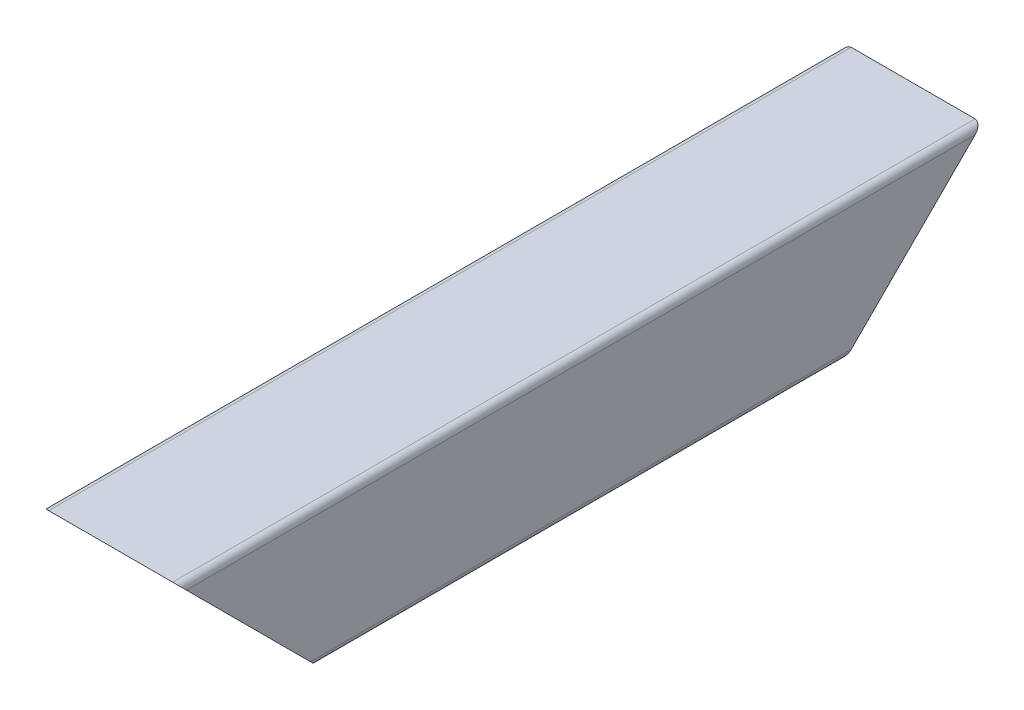
ISO-10303-21;
HEADER;
FILE_DESCRIPTION(('STEP AP214'),'2;1');
FILE_NAME('part.step','',(''),(''),'','','');
FILE_SCHEMA(('AUTOMOTIVE_DESIGN { 1 0 10303 214 1 1 1 1 }'));
ENDSEC;
DATA;
#1=APPLICATION_CONTEXT('core data for automotive mechanical design processes');
#2=APPLICATION_PROTOCOL_DEFINITION('international standard','automotive_design',2000,#1);
#3=PRODUCT_CONTEXT('',#1,'mechanical');
#4=PRODUCT('Part','Part','',(#3));
#5=PRODUCT_RELATED_PRODUCT_CATEGORY('part','',(#4));
#6=PRODUCT_DEFINITION_FORMATION('','',#4);
#7=PRODUCT_DEFINITION_CONTEXT('part definition',#1,'design');
#8=PRODUCT_DEFINITION('design','',#6,#7);
#9=PRODUCT_DEFINITION_SHAPE('','',#8);
#10=(LENGTH_UNIT() NAMED_UNIT(*) SI_UNIT(.MILLI.,.METRE.));
#11=(NAMED_UNIT(*) PLANE_ANGLE_UNIT() SI_UNIT($,.RADIAN.));
#12=(NAMED_UNIT(*) SI_UNIT($,.STERADIAN.) SOLID_ANGLE_UNIT());
#13=UNCERTAINTY_MEASURE_WITH_UNIT(LENGTH_MEASURE(1.E-05),#10,'distance_accuracy_value','');
#14=(GEOMETRIC_REPRESENTATION_CONTEXT(3) GLOBAL_UNCERTAINTY_ASSIGNED_CONTEXT((#13)) GLOBAL_UNIT_ASSIGNED_CONTEXT((#10,
#11,#12)) REPRESENTATION_CONTEXT('',''));
#15=CARTESIAN_POINT('',(0.,0.,0.));
#16=DIRECTION('',(0.,0.,1.));
#17=DIRECTION('',(1.,0.,0.));
#18=AXIS2_PLACEMENT_3D('',#15,#16,#17);
#19=CARTESIAN_POINT('',(3.,0.,350.));
#20=DIRECTION('',(-1.,0.,0.));
#21=DIRECTION('',(0.,0.,1.));
#22=AXIS2_PLACEMENT_3D('',#19,#20,#21);
#23=PLANE('',#22);
#24=DIRECTION('',(0.,0.,-1.));
#25=VECTOR('',#24,1.);
#26=CARTESIAN_POINT('',(3.,6.00000000000002,350.));
#27=LINE('',#26,#25);
#28=CARTESIAN_POINT('',(3.,6.00000000000002,296.));
#29=VERTEX_POINT('',#28);
#30=CARTESIAN_POINT('',(3.,6.00000000000002,54.0000000000002));
#31=VERTEX_POINT('',#30);
#32=EDGE_CURVE('E244',#29,#31,#27,.T.);
#33=ORIENTED_EDGE('',*,*,#32,.T.);
#34=DIRECTION('',(0.,0.707106781186546,-0.707106781186549));
#35=VECTOR('',#34,1.);
#36=CARTESIAN_POINT('',(3.,-145.,205.000000000001));
#37=LINE('',#36,#35);
#38=CARTESIAN_POINT('',(3.,54.,6.00000000000012));
#39=VERTEX_POINT('',#38);
#40=EDGE_CURVE('E59',#31,#39,#37,.T.);
#41=ORIENTED_EDGE('',*,*,#40,.T.);
#42=DIRECTION('',(0.,0.,-1.));
#43=VECTOR('',#42,1.);
#44=CARTESIAN_POINT('',(3.,54.,350.));
#45=LINE('',#44,#43);
#46=CARTESIAN_POINT('',(3.,54.,344.));
#47=VERTEX_POINT('',#46);
#48=EDGE_CURVE('E11',#47,#39,#45,.T.);
#49=ORIENTED_EDGE('',*,*,#48,.F.);
#50=DIRECTION('',(0.,0.707106781186546,0.707106781186549));
#51=VECTOR('',#50,1.);
#52=CARTESIAN_POINT('',(3.,30.,320.));
#53=LINE('',#52,#51);
#54=EDGE_CURVE('E198',#29,#47,#53,.T.);
#55=ORIENTED_EDGE('',*,*,#54,.F.);
#56=EDGE_LOOP('',(#33,#41,#49,#55));
#57=FACE_BOUND('',#56,.T.);
#58=ADVANCED_FACE('F38',(#57),#23,.F.);
#59=CARTESIAN_POINT('',(6.00000000000001,54.,350.));
#60=DIRECTION('',(0.,0.,-1.));
#61=DIRECTION('',(-1.,0.,0.));
#62=AXIS2_PLACEMENT_3D('',#59,#60,#61);
#63=CYLINDRICAL_SURFACE('',#62,3.);
#64=ORIENTED_EDGE('',*,*,#48,.T.);
#65=CARTESIAN_POINT('',(6.00000000000001,54.,6.00000000000006));
#66=DIRECTION('',(0.,0.707106781186549,0.707106781186546));
#67=DIRECTION('',(0.,0.707106781186546,-0.707106781186549));
#68=AXIS2_PLACEMENT_3D('',#65,#66,#67);
#69=ELLIPSE('',#68,4.2426406871193,3.);
#70=CARTESIAN_POINT('',(6.00000000000002,57.,3.00000000000006));
#71=VERTEX_POINT('',#70);
#72=EDGE_CURVE('E293',#39,#71,#69,.F.);
#73=ORIENTED_EDGE('',*,*,#72,.T.);
#74=DIRECTION('',(0.,0.,-1.));
#75=VECTOR('',#74,1.);
#76=CARTESIAN_POINT('',(6.00000000000002,57.,350.));
#77=LINE('',#76,#75);
#78=CARTESIAN_POINT('',(6.00000000000002,57.,347.));
#79=VERTEX_POINT('',#78);
#80=EDGE_CURVE('E48',#79,#71,#77,.T.);
#81=ORIENTED_EDGE('',*,*,#80,.F.);
#82=CARTESIAN_POINT('',(6.00000000000001,54.,344.));
#83=DIRECTION('',(0.,-0.707106781186549,0.707106781186546));
#84=DIRECTION('',(0.,-0.707106781186546,-0.707106781186549));
#85=AXIS2_PLACEMENT_3D('',#82,#83,#84);
#86=ELLIPSE('',#85,4.2426406871193,3.);
#87=EDGE_CURVE('E291',#47,#79,#86,.F.);
#88=ORIENTED_EDGE('',*,*,#87,.F.);
#89=EDGE_LOOP('',(#64,#73,#81,#88));
#90=FACE_BOUND('',#89,.T.);
#91=ADVANCED_FACE('F290',(#90),#63,.F.);
#92=CARTESIAN_POINT('',(0.,57.,350.));
#93=DIRECTION('',(0.,1.,0.));
#94=DIRECTION('',(0.,0.,1.));
#95=AXIS2_PLACEMENT_3D('',#92,#93,#94);
#96=PLANE('',#95);
#97=ORIENTED_EDGE('',*,*,#80,.T.);
#98=DIRECTION('',(1.,0.,0.));
#99=VECTOR('',#98,1.);
#100=CARTESIAN_POINT('',(0.,57.,3.00000000000006));
#101=LINE('',#100,#99);
#102=CARTESIAN_POINT('',(54.,57.,3.00000000000006));
#103=VERTEX_POINT('',#102);
#104=EDGE_CURVE('E285',#71,#103,#101,.T.);
#105=ORIENTED_EDGE('',*,*,#104,.T.);
#106=DIRECTION('',(0.,0.,-1.));
#107=VECTOR('',#106,1.);
#108=CARTESIAN_POINT('',(54.,57.,350.));
#109=LINE('',#108,#107);
#110=CARTESIAN_POINT('',(54.,57.,347.));
#111=VERTEX_POINT('',#110);
#112=EDGE_CURVE('E275',#111,#103,#109,.T.);
#113=ORIENTED_EDGE('',*,*,#112,.F.);
#114=DIRECTION('',(1.,0.,0.));
#115=VECTOR('',#114,1.);
#116=CARTESIAN_POINT('',(0.,57.,347.));
#117=LINE('',#116,#115);
#118=EDGE_CURVE('E286',#79,#111,#117,.T.);
#119=ORIENTED_EDGE('',*,*,#118,.F.);
#120=EDGE_LOOP('',(#97,#105,#113,#119));
#121=FACE_BOUND('',#120,.T.);
#122=ADVANCED_FACE('F283',(#121),#96,.F.);
#123=CARTESIAN_POINT('',(54.,54.,350.));
#124=DIRECTION('',(0.,0.,-1.));
#125=DIRECTION('',(-1.,0.,0.));
#126=AXIS2_PLACEMENT_3D('',#123,#124,#125);
#127=CYLINDRICAL_SURFACE('',#126,3.);
#128=ORIENTED_EDGE('',*,*,#112,.T.);
#129=CARTESIAN_POINT('',(54.,54.,6.00000000000006));
#130=DIRECTION('',(0.,0.707106781186549,0.707106781186546));
#131=DIRECTION('',(0.,0.707106781186546,-0.707106781186549));
#132=AXIS2_PLACEMENT_3D('',#129,#130,#131);
#133=ELLIPSE('',#132,4.2426406871193,3.);
#134=CARTESIAN_POINT('',(57.,53.9999999999999,6.00000000000009));
#135=VERTEX_POINT('',#134);
#136=EDGE_CURVE('E300',#103,#135,#133,.F.);
#137=ORIENTED_EDGE('',*,*,#136,.T.);
#138=DIRECTION('',(0.,0.,-1.));
#139=VECTOR('',#138,1.);
#140=CARTESIAN_POINT('',(57.,54.,350.));
#141=LINE('',#140,#139);
#142=CARTESIAN_POINT('',(57.,54.,344.));
#143=VERTEX_POINT('',#142);
#144=EDGE_CURVE('E271',#143,#135,#141,.T.);
#145=ORIENTED_EDGE('',*,*,#144,.F.);
#146=CARTESIAN_POINT('',(54.,54.,344.));
#147=DIRECTION('',(0.,-0.707106781186549,0.707106781186546));
#148=DIRECTION('',(0.,-0.707106781186546,-0.707106781186549));
#149=AXIS2_PLACEMENT_3D('',#146,#147,#148);
#150=ELLIPSE('',#149,4.2426406871193,3.);
#151=EDGE_CURVE('E335',#111,#143,#150,.F.);
#152=ORIENTED_EDGE('',*,*,#151,.F.);
#153=EDGE_LOOP('',(#128,#137,#145,#152));
#154=FACE_BOUND('',#153,.T.);
#155=ADVANCED_FACE('F371',(#154),#127,.F.);
#156=CARTESIAN_POINT('',(57.,0.,350.));
#157=DIRECTION('',(-1.,0.,0.));
#158=DIRECTION('',(0.,0.,1.));
#159=AXIS2_PLACEMENT_3D('',#156,#157,#158);
#160=PLANE('',#159);
#161=DIRECTION('',(0.,0.707106781186546,-0.707106781186549));
#162=VECTOR('',#161,1.);
#163=CARTESIAN_POINT('',(57.,-145.,205.000000000001));
#164=LINE('',#163,#162);
#165=CARTESIAN_POINT('',(57.,6.00000000000002,54.0000000000002));
#166=VERTEX_POINT('',#165);
#167=EDGE_CURVE('E364',#166,#135,#164,.T.);
#168=ORIENTED_EDGE('',*,*,#167,.F.);
#169=DIRECTION('',(0.,0.,-1.));
#170=VECTOR('',#169,1.);
#171=CARTESIAN_POINT('',(57.,6.00000000000002,350.));
#172=LINE('',#171,#170);
#173=CARTESIAN_POINT('',(57.,6.00000000000002,296.));
#174=VERTEX_POINT('',#173);
#175=EDGE_CURVE('E267',#174,#166,#172,.T.);
#176=ORIENTED_EDGE('',*,*,#175,.F.);
#177=DIRECTION('',(0.,0.707106781186546,0.707106781186549));
#178=VECTOR('',#177,1.);
#179=CARTESIAN_POINT('',(57.,30.,320.));
#180=LINE('',#179,#178);
#181=EDGE_CURVE('E331',#174,#143,#180,.T.);
#182=ORIENTED_EDGE('',*,*,#181,.T.);
#183=ORIENTED_EDGE('',*,*,#144,.T.);
#184=EDGE_LOOP('',(#168,#176,#182,#183));
#185=FACE_BOUND('',#184,.T.);
#186=ADVANCED_FACE('F375',(#185),#160,.T.);
#187=CARTESIAN_POINT('',(54.,6.,350.));
#188=DIRECTION('',(0.,0.,-1.));
#189=DIRECTION('',(-1.,0.,0.));
#190=AXIS2_PLACEMENT_3D('',#187,#188,#189);
#191=CYLINDRICAL_SURFACE('',#190,3.);
#192=ORIENTED_EDGE('',*,*,#175,.T.);
#193=CARTESIAN_POINT('',(54.,6.,54.0000000000002));
#194=DIRECTION('',(0.,0.707106781186549,0.707106781186546));
#195=DIRECTION('',(0.,0.707106781186546,-0.707106781186549));
#196=AXIS2_PLACEMENT_3D('',#193,#194,#195);
#197=ELLIPSE('',#196,4.24264068711929,3.);
#198=CARTESIAN_POINT('',(54.,3.,57.0000000000003));
#199=VERTEX_POINT('',#198);
#200=EDGE_CURVE('E354',#166,#199,#197,.F.);
#201=ORIENTED_EDGE('',*,*,#200,.T.);
#202=DIRECTION('',(0.,0.,-1.));
#203=VECTOR('',#202,1.);
#204=CARTESIAN_POINT('',(54.,3.,350.));
#205=LINE('',#204,#203);
#206=CARTESIAN_POINT('',(54.,3.,293.));
#207=VERTEX_POINT('',#206);
#208=EDGE_CURVE('E260',#207,#199,#205,.T.);
#209=ORIENTED_EDGE('',*,*,#208,.F.);
#210=CARTESIAN_POINT('',(54.,6.,296.));
#211=DIRECTION('',(0.,-0.707106781186549,0.707106781186546));
#212=DIRECTION('',(0.,-0.707106781186546,-0.707106781186549));
#213=AXIS2_PLACEMENT_3D('',#210,#211,#212);
#214=ELLIPSE('',#213,4.24264068711929,3.);
#215=EDGE_CURVE('E328',#174,#207,#214,.F.);
#216=ORIENTED_EDGE('',*,*,#215,.F.);
#217=EDGE_LOOP('',(#192,#201,#209,#216));
#218=FACE_BOUND('',#217,.T.);
#219=ADVANCED_FACE('F380',(#218),#191,.F.);
#220=CARTESIAN_POINT('',(0.,3.,350.));
#221=DIRECTION('',(0.,1.,0.));
#222=DIRECTION('',(0.,0.,1.));
#223=AXIS2_PLACEMENT_3D('',#220,#221,#222);
#224=PLANE('',#223);
#225=DIRECTION('',(1.,0.,0.));
#226=VECTOR('',#225,1.);
#227=CARTESIAN_POINT('',(0.,3.,57.0000000000003));
#228=LINE('',#227,#226);
#229=CARTESIAN_POINT('',(6.00000000000002,3.,57.0000000000002));
#230=VERTEX_POINT('',#229);
#231=EDGE_CURVE('E350',#230,#199,#228,.T.);
#232=ORIENTED_EDGE('',*,*,#231,.F.);
#233=DIRECTION('',(0.,0.,-1.));
#234=VECTOR('',#233,1.);
#235=CARTESIAN_POINT('',(6.00000000000002,3.,350.));
#236=LINE('',#235,#234);
#237=CARTESIAN_POINT('',(6.00000000000002,3.,293.));
#238=VERTEX_POINT('',#237);
#239=EDGE_CURVE('E252',#238,#230,#236,.T.);
#240=ORIENTED_EDGE('',*,*,#239,.F.);
#241=DIRECTION('',(1.,0.,0.));
#242=VECTOR('',#241,1.);
#243=CARTESIAN_POINT('',(0.,3.,293.));
#244=LINE('',#243,#242);
#245=EDGE_CURVE('E70',#238,#207,#244,.T.);
#246=ORIENTED_EDGE('',*,*,#245,.T.);
#247=ORIENTED_EDGE('',*,*,#208,.T.);
#248=EDGE_LOOP('',(#232,#240,#246,#247));
#249=FACE_BOUND('',#248,.T.);
#250=ADVANCED_FACE('F382',(#249),#224,.T.);
#251=CARTESIAN_POINT('',(3.,57.,350.));
#252=DIRECTION('',(0.,0.,-1.));
#253=DIRECTION('',(-1.,0.,0.));
#254=AXIS2_PLACEMENT_3D('',#251,#252,#253);
#255=CYLINDRICAL_SURFACE('',#254,3.);
#256=CARTESIAN_POINT('',(3.,57.,3.00000000000006));
#257=DIRECTION('',(0.,0.707106781186549,0.707106781186546));
#258=DIRECTION('',(0.,0.707106781186546,-0.707106781186549));
#259=AXIS2_PLACEMENT_3D('',#256,#257,#258);
#260=ELLIPSE('',#259,4.2426406871193,3.);
#261=CARTESIAN_POINT('',(0.,56.9999999999999,3.00000000000009));
#262=VERTEX_POINT('',#261);
#263=CARTESIAN_POINT('',(3.00000000000002,60.,0.));
#264=VERTEX_POINT('',#263);
#265=EDGE_CURVE('E191',#262,#264,#260,.F.);
#266=ORIENTED_EDGE('',*,*,#265,.F.);
#267=DIRECTION('',(0.,0.,-1.));
#268=VECTOR('',#267,1.);
#269=CARTESIAN_POINT('',(0.,57.,350.));
#270=LINE('',#269,#268);
#271=CARTESIAN_POINT('',(0.,57.,347.));
#272=VERTEX_POINT('',#271);
#273=EDGE_CURVE('E42',#272,#262,#270,.T.);
#274=ORIENTED_EDGE('',*,*,#273,.F.);
#275=CARTESIAN_POINT('',(3.,57.,347.));
#276=DIRECTION('',(0.,-0.707106781186549,0.707106781186546));
#277=DIRECTION('',(0.,-0.707106781186546,-0.707106781186549));
#278=AXIS2_PLACEMENT_3D('',#275,#276,#277);
#279=ELLIPSE('',#278,4.2426406871193,3.);
#280=CARTESIAN_POINT('',(3.,59.9999999999998,350.));
#281=VERTEX_POINT('',#280);
#282=EDGE_CURVE('E320',#272,#281,#279,.F.);
#283=ORIENTED_EDGE('',*,*,#282,.T.);
#284=DIRECTION('',(0.,0.,-1.));
#285=VECTOR('',#284,1.);
#286=CARTESIAN_POINT('',(3.00000000000002,60.,350.));
#287=LINE('',#286,#285);
#288=EDGE_CURVE('E214',#281,#264,#287,.T.);
#289=ORIENTED_EDGE('',*,*,#288,.T.);
#290=EDGE_LOOP('',(#266,#274,#283,#289));
#291=FACE_BOUND('',#290,.T.);
#292=ADVANCED_FACE('F40',(#291),#255,.T.);
#293=CARTESIAN_POINT('',(0.,0.,350.));
#294=DIRECTION('',(-1.,0.,0.));
#295=DIRECTION('',(0.,0.,1.));
#296=AXIS2_PLACEMENT_3D('',#293,#294,#295);
#297=PLANE('',#296);
#298=DIRECTION('',(0.,0.707106781186546,-0.707106781186549));
#299=VECTOR('',#298,1.);
#300=CARTESIAN_POINT('',(0.,-145.,205.000000000001));
#301=LINE('',#300,#299);
#302=CARTESIAN_POINT('',(0.,3.00000000000002,57.0000000000002));
#303=VERTEX_POINT('',#302);
#304=EDGE_CURVE('E357',#303,#262,#301,.T.);
#305=ORIENTED_EDGE('',*,*,#304,.F.);
#306=DIRECTION('',(0.,0.,-1.));
#307=VECTOR('',#306,1.);
#308=CARTESIAN_POINT('',(0.,3.00000000000002,350.));
#309=LINE('',#308,#307);
#310=CARTESIAN_POINT('',(0.,3.00000000000002,293.));
#311=VERTEX_POINT('',#310);
#312=EDGE_CURVE('E233',#311,#303,#309,.T.);
#313=ORIENTED_EDGE('',*,*,#312,.F.);
#314=DIRECTION('',(0.,0.707106781186546,0.707106781186549));
#315=VECTOR('',#314,1.);
#316=CARTESIAN_POINT('',(0.,30.,320.));
#317=LINE('',#316,#315);
#318=EDGE_CURVE('E317',#311,#272,#317,.T.);
#319=ORIENTED_EDGE('',*,*,#318,.T.);
#320=ORIENTED_EDGE('',*,*,#273,.T.);
#321=EDGE_LOOP('',(#305,#313,#319,#320));
#322=FACE_BOUND('',#321,.T.);
#323=ADVANCED_FACE('F416',(#322),#297,.T.);
#324=CARTESIAN_POINT('',(3.,3.,350.));
#325=DIRECTION('',(0.,0.,-1.));
#326=DIRECTION('',(-1.,0.,0.));
#327=AXIS2_PLACEMENT_3D('',#324,#325,#326);
#328=CYLINDRICAL_SURFACE('',#327,3.);
#329=CARTESIAN_POINT('',(3.,3.,57.0000000000003));
#330=DIRECTION('',(0.,0.707106781186549,0.707106781186546));
#331=DIRECTION('',(0.,0.707106781186546,-0.707106781186549));
#332=AXIS2_PLACEMENT_3D('',#329,#330,#331);
#333=ELLIPSE('',#332,4.24264068711929,3.);
#334=CARTESIAN_POINT('',(3.00000000000002,0.,60.0000000000003));
#335=VERTEX_POINT('',#334);
#336=EDGE_CURVE('E423',#335,#303,#333,.F.);
#337=ORIENTED_EDGE('',*,*,#336,.F.);
#338=DIRECTION('',(0.,0.,-1.));
#339=VECTOR('',#338,1.);
#340=CARTESIAN_POINT('',(3.00000000000002,0.,350.));
#341=LINE('',#340,#339);
#342=CARTESIAN_POINT('',(3.00000000000002,0.,290.));
#343=VERTEX_POINT('',#342);
#344=EDGE_CURVE('E230',#343,#335,#341,.T.);
#345=ORIENTED_EDGE('',*,*,#344,.F.);
#346=CARTESIAN_POINT('',(3.,3.,293.));
#347=DIRECTION('',(0.,-0.707106781186549,0.707106781186546));
#348=DIRECTION('',(0.,-0.707106781186546,-0.707106781186549));
#349=AXIS2_PLACEMENT_3D('',#346,#347,#348);
#350=ELLIPSE('',#349,4.24264068711929,3.);
#351=EDGE_CURVE('E315',#343,#311,#350,.F.);
#352=ORIENTED_EDGE('',*,*,#351,.T.);
#353=ORIENTED_EDGE('',*,*,#312,.T.);
#354=EDGE_LOOP('',(#337,#345,#352,#353));
#355=FACE_BOUND('',#354,.T.);
#356=ADVANCED_FACE('F413',(#355),#328,.T.);
#357=CARTESIAN_POINT('',(0.,0.,350.));
#358=DIRECTION('',(0.,1.,0.));
#359=DIRECTION('',(0.,0.,1.));
#360=AXIS2_PLACEMENT_3D('',#357,#358,#359);
#361=PLANE('',#360);
#362=ORIENTED_EDGE('',*,*,#344,.T.);
#363=DIRECTION('',(1.,0.,0.));
#364=VECTOR('',#363,1.);
#365=CARTESIAN_POINT('',(0.,0.,60.0000000000003));
#366=LINE('',#365,#364);
#367=CARTESIAN_POINT('',(57.,0.,60.0000000000003));
#368=VERTEX_POINT('',#367);
#369=EDGE_CURVE('E424',#335,#368,#366,.T.);
#370=ORIENTED_EDGE('',*,*,#369,.T.);
#371=DIRECTION('',(0.,0.,-1.));
#372=VECTOR('',#371,1.);
#373=CARTESIAN_POINT('',(57.,0.,350.));
#374=LINE('',#373,#372);
#375=CARTESIAN_POINT('',(57.,0.,290.));
#376=VERTEX_POINT('',#375);
#377=EDGE_CURVE('E226',#376,#368,#374,.T.);
#378=ORIENTED_EDGE('',*,*,#377,.F.);
#379=DIRECTION('',(1.,0.,0.));
#380=VECTOR('',#379,1.);
#381=CARTESIAN_POINT('',(0.,0.,290.));
#382=LINE('',#381,#380);
#383=EDGE_CURVE('E312',#343,#376,#382,.T.);
#384=ORIENTED_EDGE('',*,*,#383,.F.);
#385=EDGE_LOOP('',(#362,#370,#378,#384));
#386=FACE_BOUND('',#385,.T.);
#387=ADVANCED_FACE('F409',(#386),#361,.F.);
#388=CARTESIAN_POINT('',(57.,3.,350.));
#389=DIRECTION('',(0.,0.,-1.));
#390=DIRECTION('',(-1.,0.,0.));
#391=AXIS2_PLACEMENT_3D('',#388,#389,#390);
#392=CYLINDRICAL_SURFACE('',#391,3.);
#393=ORIENTED_EDGE('',*,*,#377,.T.);
#394=CARTESIAN_POINT('',(57.,3.,57.0000000000003));
#395=DIRECTION('',(0.,0.707106781186549,0.707106781186546));
#396=DIRECTION('',(0.,0.707106781186546,-0.707106781186549));
#397=AXIS2_PLACEMENT_3D('',#394,#395,#396);
#398=ELLIPSE('',#397,4.24264068711929,3.);
#399=CARTESIAN_POINT('',(60.,3.00000000000003,57.0000000000002));
#400=VERTEX_POINT('',#399);
#401=EDGE_CURVE('E429',#368,#400,#398,.T.);
#402=ORIENTED_EDGE('',*,*,#401,.T.);
#403=DIRECTION('',(0.,0.,-1.));
#404=VECTOR('',#403,1.);
#405=CARTESIAN_POINT('',(60.,3.00000000000002,350.));
#406=LINE('',#405,#404);
#407=CARTESIAN_POINT('',(60.,3.00000000000002,293.));
#408=VERTEX_POINT('',#407);
#409=EDGE_CURVE('E219',#408,#400,#406,.T.);
#410=ORIENTED_EDGE('',*,*,#409,.F.);
#411=CARTESIAN_POINT('',(57.,3.,293.));
#412=DIRECTION('',(0.,-0.707106781186549,0.707106781186546));
#413=DIRECTION('',(0.,-0.707106781186546,-0.707106781186549));
#414=AXIS2_PLACEMENT_3D('',#411,#412,#413);
#415=ELLIPSE('',#414,4.24264068711929,3.);
#416=EDGE_CURVE('E309',#376,#408,#415,.T.);
#417=ORIENTED_EDGE('',*,*,#416,.F.);
#418=EDGE_LOOP('',(#393,#402,#410,#417));
#419=FACE_BOUND('',#418,.T.);
#420=ADVANCED_FACE('F405',(#419),#392,.T.);
#421=CARTESIAN_POINT('',(60.,0.,350.));
#422=DIRECTION('',(-1.,0.,0.));
#423=DIRECTION('',(0.,0.,1.));
#424=AXIS2_PLACEMENT_3D('',#421,#422,#423);
#425=PLANE('',#424);
#426=ORIENTED_EDGE('',*,*,#409,.T.);
#427=DIRECTION('',(0.,0.707106781186546,-0.707106781186549));
#428=VECTOR('',#427,1.);
#429=CARTESIAN_POINT('',(60.,-145.,205.000000000001));
#430=LINE('',#429,#428);
#431=CARTESIAN_POINT('',(60.,57.,3.00000000000006));
#432=VERTEX_POINT('',#431);
#433=EDGE_CURVE('E210',#400,#432,#430,.T.);
#434=ORIENTED_EDGE('',*,*,#433,.T.);
#435=DIRECTION('',(0.,0.,-1.));
#436=VECTOR('',#435,1.);
#437=CARTESIAN_POINT('',(60.,57.,350.));
#438=LINE('',#437,#436);
#439=CARTESIAN_POINT('',(60.,57.,347.));
#440=VERTEX_POINT('',#439);
#441=EDGE_CURVE('E208',#440,#432,#438,.T.);
#442=ORIENTED_EDGE('',*,*,#441,.F.);
#443=DIRECTION('',(0.,0.707106781186546,0.707106781186549));
#444=VECTOR('',#443,1.);
#445=CARTESIAN_POINT('',(60.,30.,320.));
#446=LINE('',#445,#444);
#447=EDGE_CURVE('E306',#408,#440,#446,.T.);
#448=ORIENTED_EDGE('',*,*,#447,.F.);
#449=EDGE_LOOP('',(#426,#434,#442,#448));
#450=FACE_BOUND('',#449,.T.);
#451=ADVANCED_FACE('F402',(#450),#425,.F.);
#452=CARTESIAN_POINT('',(57.,57.,350.));
#453=DIRECTION('',(0.,0.,-1.));
#454=DIRECTION('',(-1.,0.,0.));
#455=AXIS2_PLACEMENT_3D('',#452,#453,#454);
#456=CYLINDRICAL_SURFACE('',#455,3.);
#457=CARTESIAN_POINT('',(57.,57.,3.00000000000006));
#458=DIRECTION('',(0.,0.707106781186549,0.707106781186546));
#459=DIRECTION('',(0.,0.707106781186546,-0.707106781186549));
#460=AXIS2_PLACEMENT_3D('',#457,#458,#459);
#461=ELLIPSE('',#460,4.2426406871193,3.);
#462=CARTESIAN_POINT('',(57.,60.,0.));
#463=VERTEX_POINT('',#462);
#464=EDGE_CURVE('E188',#463,#432,#461,.F.);
#465=ORIENTED_EDGE('',*,*,#464,.F.);
#466=DIRECTION('',(0.,0.,-1.));
#467=VECTOR('',#466,1.);
#468=CARTESIAN_POINT('',(57.,60.,350.));
#469=LINE('',#468,#467);
#470=CARTESIAN_POINT('',(57.,60.,350.));
#471=VERTEX_POINT('',#470);
#472=EDGE_CURVE('E205',#471,#463,#469,.T.);
#473=ORIENTED_EDGE('',*,*,#472,.F.);
#474=CARTESIAN_POINT('',(57.,57.,347.));
#475=DIRECTION('',(0.,-0.707106781186549,0.707106781186546));
#476=DIRECTION('',(0.,-0.707106781186546,-0.707106781186549));
#477=AXIS2_PLACEMENT_3D('',#474,#475,#476);
#478=ELLIPSE('',#477,4.2426406871193,3.);
#479=EDGE_CURVE('E298',#471,#440,#478,.F.);
#480=ORIENTED_EDGE('',*,*,#479,.T.);
#481=ORIENTED_EDGE('',*,*,#441,.T.);
#482=EDGE_LOOP('',(#465,#473,#480,#481));
#483=FACE_BOUND('',#482,.T.);
#484=ADVANCED_FACE('F203',(#483),#456,.T.);
#485=CARTESIAN_POINT('',(6.00000000000001,6.,350.));
#486=DIRECTION('',(0.,0.,-1.));
#487=DIRECTION('',(-1.,0.,0.));
#488=AXIS2_PLACEMENT_3D('',#485,#486,#487);
#489=CYLINDRICAL_SURFACE('',#488,3.);
#490=CARTESIAN_POINT('',(6.00000000000001,6.,54.0000000000002));
#491=DIRECTION('',(0.,0.707106781186549,0.707106781186546));
#492=DIRECTION('',(0.,0.707106781186546,-0.707106781186549));
#493=AXIS2_PLACEMENT_3D('',#490,#491,#492);
#494=ELLIPSE('',#493,4.24264068711929,3.);
#495=EDGE_CURVE('E347',#31,#230,#494,.T.);
#496=ORIENTED_EDGE('',*,*,#495,.F.);
#497=ORIENTED_EDGE('',*,*,#32,.F.);
#498=CARTESIAN_POINT('',(6.00000000000001,6.,296.));
#499=DIRECTION('',(0.,-0.707106781186549,0.707106781186546));
#500=DIRECTION('',(0.,-0.707106781186546,-0.707106781186549));
#501=AXIS2_PLACEMENT_3D('',#498,#499,#500);
#502=ELLIPSE('',#501,4.24264068711929,3.);
#503=EDGE_CURVE('E324',#29,#238,#502,.T.);
#504=ORIENTED_EDGE('',*,*,#503,.T.);
#505=ORIENTED_EDGE('',*,*,#239,.T.);
#506=EDGE_LOOP('',(#496,#497,#504,#505));
#507=FACE_BOUND('',#506,.T.);
#508=ADVANCED_FACE('F345',(#507),#489,.F.);
#509=CARTESIAN_POINT('',(0.,60.,350.));
#510=DIRECTION('',(0.,1.,0.));
#511=DIRECTION('',(0.,0.,1.));
#512=AXIS2_PLACEMENT_3D('',#509,#510,#511);
#513=PLANE('',#512);
#514=DIRECTION('',(1.,0.,0.));
#515=VECTOR('',#514,1.);
#516=CARTESIAN_POINT('',(0.,60.,0.));
#517=LINE('',#516,#515);
#518=EDGE_CURVE('E185',#264,#463,#517,.T.);
#519=ORIENTED_EDGE('',*,*,#518,.F.);
#520=ORIENTED_EDGE('',*,*,#288,.F.);
#521=DIRECTION('',(1.,0.,0.));
#522=VECTOR('',#521,1.);
#523=CARTESIAN_POINT('',(0.,60.,350.));
#524=LINE('',#523,#522);
#525=EDGE_CURVE('E197',#281,#471,#524,.T.);
#526=ORIENTED_EDGE('',*,*,#525,.T.);
#527=ORIENTED_EDGE('',*,*,#472,.T.);
#528=EDGE_LOOP('',(#519,#520,#526,#527));
#529=FACE_BOUND('',#528,.T.);
#530=ADVANCED_FACE('F212',(#529),#513,.T.);
#531=CARTESIAN_POINT('',(0.,-145.,144.999999999999));
#532=DIRECTION('',(0.,-0.707106781186549,0.707106781186546));
#533=DIRECTION('',(0.,-0.707106781186546,-0.707106781186549));
#534=AXIS2_PLACEMENT_3D('',#531,#532,#533);
#535=PLANE('',#534);
#536=ORIENTED_EDGE('',*,*,#318,.F.);
#537=ORIENTED_EDGE('',*,*,#351,.F.);
#538=ORIENTED_EDGE('',*,*,#383,.T.);
#539=ORIENTED_EDGE('',*,*,#416,.T.);
#540=ORIENTED_EDGE('',*,*,#447,.T.);
#541=ORIENTED_EDGE('',*,*,#479,.F.);
#542=ORIENTED_EDGE('',*,*,#525,.F.);
#543=ORIENTED_EDGE('',*,*,#282,.F.);
#544=EDGE_LOOP('',(#536,#537,#538,#539,#540,#541,#542,#543));
#545=FACE_BOUND('',#544,.T.);
#546=ORIENTED_EDGE('',*,*,#54,.T.);
#547=ORIENTED_EDGE('',*,*,#87,.T.);
#548=ORIENTED_EDGE('',*,*,#118,.T.);
#549=ORIENTED_EDGE('',*,*,#151,.T.);
#550=ORIENTED_EDGE('',*,*,#181,.F.);
#551=ORIENTED_EDGE('',*,*,#215,.T.);
#552=ORIENTED_EDGE('',*,*,#245,.F.);
#553=ORIENTED_EDGE('',*,*,#503,.F.);
#554=EDGE_LOOP('',(#546,#547,#548,#549,#550,#551,#552,#553));
#555=FACE_BOUND('',#554,.T.);
#556=ADVANCED_FACE('F343',(#545,#555),#535,.T.);
#557=CARTESIAN_POINT('',(0.,30.0000000000001,30.));
#558=DIRECTION('',(0.,0.707106781186549,0.707106781186546));
#559=DIRECTION('',(0.,-0.707106781186546,0.707106781186549));
#560=AXIS2_PLACEMENT_3D('',#557,#558,#559);
#561=PLANE('',#560);
#562=ORIENTED_EDGE('',*,*,#265,.T.);
#563=ORIENTED_EDGE('',*,*,#518,.T.);
#564=ORIENTED_EDGE('',*,*,#464,.T.);
#565=ORIENTED_EDGE('',*,*,#433,.F.);
#566=ORIENTED_EDGE('',*,*,#401,.F.);
#567=ORIENTED_EDGE('',*,*,#369,.F.);
#568=ORIENTED_EDGE('',*,*,#336,.T.);
#569=ORIENTED_EDGE('',*,*,#304,.T.);
#570=EDGE_LOOP('',(#562,#563,#564,#565,#566,#567,#568,#569));
#571=FACE_BOUND('',#570,.T.);
#572=ORIENTED_EDGE('',*,*,#495,.T.);
#573=ORIENTED_EDGE('',*,*,#231,.T.);
#574=ORIENTED_EDGE('',*,*,#200,.F.);
#575=ORIENTED_EDGE('',*,*,#167,.T.);
#576=ORIENTED_EDGE('',*,*,#136,.F.);
#577=ORIENTED_EDGE('',*,*,#104,.F.);
#578=ORIENTED_EDGE('',*,*,#72,.F.);
#579=ORIENTED_EDGE('',*,*,#40,.F.);
#580=EDGE_LOOP('',(#572,#573,#574,#575,#576,#577,#578,#579));
#581=FACE_BOUND('',#580,.T.);
#582=ADVANCED_FACE('F187',(#571,#581),#561,.F.);
#583=CLOSED_SHELL('',(#58,#91,#122,#155,#186,#219,#250,#292,#323,#356,#387,#420,#451,#484,#508,
#530,#556,#582));
#584=MANIFOLD_SOLID_BREP('B2',#583);
#585=ADVANCED_BREP_SHAPE_REPRESENTATION('',(#18,#584),#14);
#586=SHAPE_DEFINITION_REPRESENTATION(#9,#585);
ENDSEC;
END-ISO-10303-21;
